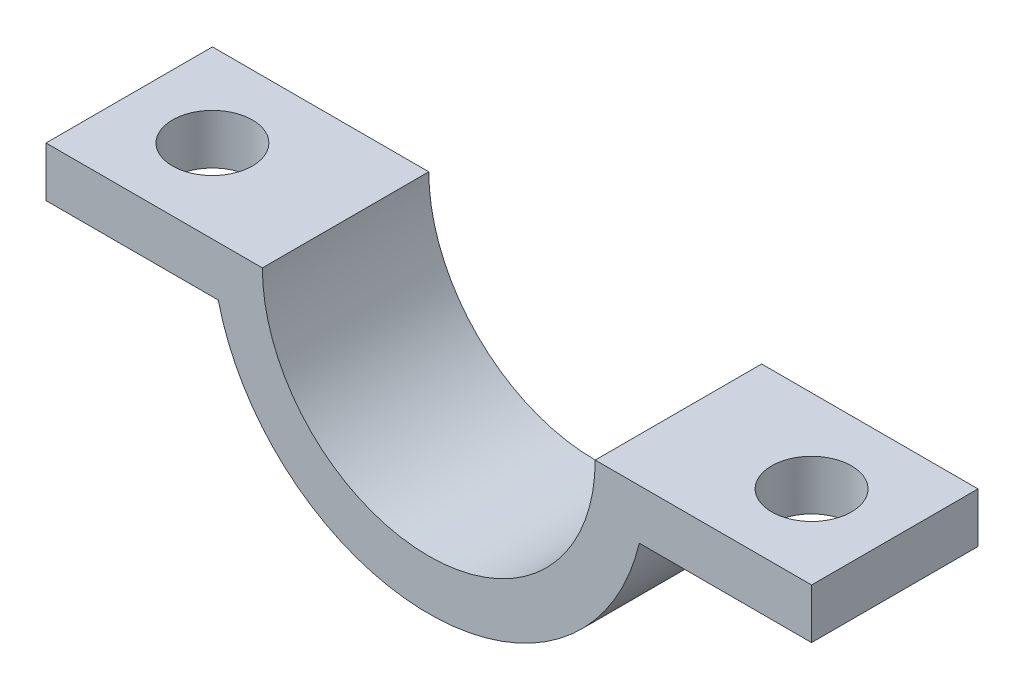
ISO-10303-21;
HEADER;
FILE_DESCRIPTION(('STEP AP214'),'2;1');
FILE_NAME('part.step','',(''),(''),'','','');
FILE_SCHEMA(('AUTOMOTIVE_DESIGN { 1 0 10303 214 1 1 1 1 }'));
ENDSEC;
DATA;
#1=APPLICATION_CONTEXT('core data for automotive mechanical design processes');
#2=APPLICATION_PROTOCOL_DEFINITION('international standard','automotive_design',2000,#1);
#3=PRODUCT_CONTEXT('',#1,'mechanical');
#4=PRODUCT('Part','Part','',(#3));
#5=PRODUCT_RELATED_PRODUCT_CATEGORY('part','',(#4));
#6=PRODUCT_DEFINITION_FORMATION('','',#4);
#7=PRODUCT_DEFINITION_CONTEXT('part definition',#1,'design');
#8=PRODUCT_DEFINITION('design','',#6,#7);
#9=PRODUCT_DEFINITION_SHAPE('','',#8);
#10=(LENGTH_UNIT() NAMED_UNIT(*) SI_UNIT(.MILLI.,.METRE.));
#11=(NAMED_UNIT(*) PLANE_ANGLE_UNIT() SI_UNIT($,.RADIAN.));
#12=(NAMED_UNIT(*) SI_UNIT($,.STERADIAN.) SOLID_ANGLE_UNIT());
#13=UNCERTAINTY_MEASURE_WITH_UNIT(LENGTH_MEASURE(1.E-05),#10,'distance_accuracy_value','');
#14=(GEOMETRIC_REPRESENTATION_CONTEXT(3) GLOBAL_UNCERTAINTY_ASSIGNED_CONTEXT((#13)) GLOBAL_UNIT_ASSIGNED_CONTEXT((#10,
#11,#12)) REPRESENTATION_CONTEXT('',''));
#15=CARTESIAN_POINT('',(0.,0.,0.));
#16=DIRECTION('',(0.,0.,1.));
#17=DIRECTION('',(1.,0.,0.));
#18=AXIS2_PLACEMENT_3D('',#15,#16,#17);
#19=CARTESIAN_POINT('',(11.5,0.,2.5));
#20=DIRECTION('',(-1.,0.,0.));
#21=DIRECTION('',(0.,0.,1.));
#22=AXIS2_PLACEMENT_3D('',#19,#20,#21);
#23=PLANE('',#22);
#24=DIRECTION('',(0.,1.,0.));
#25=VECTOR('',#24,1.);
#26=CARTESIAN_POINT('',(11.5,0.,-2.5));
#27=LINE('',#26,#25);
#28=CARTESIAN_POINT('',(11.5,-1.5,-2.5));
#29=VERTEX_POINT('',#28);
#30=CARTESIAN_POINT('',(11.5,0.,-2.5));
#31=VERTEX_POINT('',#30);
#32=EDGE_CURVE('E134',#29,#31,#27,.T.);
#33=ORIENTED_EDGE('',*,*,#32,.T.);
#34=DIRECTION('',(0.,0.,-1.));
#35=VECTOR('',#34,1.);
#36=CARTESIAN_POINT('',(11.5,0.,2.5));
#37=LINE('',#36,#35);
#38=CARTESIAN_POINT('',(11.5,0.,2.5));
#39=VERTEX_POINT('',#38);
#40=EDGE_CURVE('E11',#39,#31,#37,.T.);
#41=ORIENTED_EDGE('',*,*,#40,.F.);
#42=DIRECTION('',(0.,1.,0.));
#43=VECTOR('',#42,1.);
#44=CARTESIAN_POINT('',(11.5,0.,2.5));
#45=LINE('',#44,#43);
#46=CARTESIAN_POINT('',(11.5,-1.5,2.5));
#47=VERTEX_POINT('',#46);
#48=EDGE_CURVE('E148',#47,#39,#45,.T.);
#49=ORIENTED_EDGE('',*,*,#48,.F.);
#50=DIRECTION('',(0.,0.,-1.));
#51=VECTOR('',#50,1.);
#52=CARTESIAN_POINT('',(11.5,-1.5,2.5));
#53=LINE('',#52,#51);
#54=EDGE_CURVE('E130',#47,#29,#53,.T.);
#55=ORIENTED_EDGE('',*,*,#54,.T.);
#56=EDGE_LOOP('',(#33,#41,#49,#55));
#57=FACE_BOUND('',#56,.T.);
#58=ADVANCED_FACE('F36',(#57),#23,.F.);
#59=CARTESIAN_POINT('',(5.,0.,2.5));
#60=DIRECTION('',(0.,-1.,0.));
#61=DIRECTION('',(0.,0.,-1.));
#62=AXIS2_PLACEMENT_3D('',#59,#60,#61);
#63=PLANE('',#62);
#64=CARTESIAN_POINT('',(9.,0.,0.));
#65=DIRECTION('',(0.,1.,0.));
#66=DIRECTION('',(0.,0.,-1.));
#67=AXIS2_PLACEMENT_3D('',#64,#65,#66);
#68=CIRCLE('',#67,1.2);
#69=CARTESIAN_POINT('',(9.,0.,-1.2));
#70=VERTEX_POINT('',#69);
#71=EDGE_CURVE('E166',#70,#70,#68,.T.);
#72=ORIENTED_EDGE('',*,*,#71,.F.);
#73=EDGE_LOOP('',(#72));
#74=FACE_BOUND('',#73,.T.);
#75=DIRECTION('',(-1.,0.,0.));
#76=VECTOR('',#75,1.);
#77=CARTESIAN_POINT('',(5.,0.,-2.5));
#78=LINE('',#77,#76);
#79=CARTESIAN_POINT('',(5.,0.,-2.5));
#80=VERTEX_POINT('',#79);
#81=EDGE_CURVE('E137',#31,#80,#78,.T.);
#82=ORIENTED_EDGE('',*,*,#81,.T.);
#83=DIRECTION('',(0.,0.,-1.));
#84=VECTOR('',#83,1.);
#85=CARTESIAN_POINT('',(5.,0.,2.5));
#86=LINE('',#85,#84);
#87=CARTESIAN_POINT('',(5.,0.,2.5));
#88=VERTEX_POINT('',#87);
#89=EDGE_CURVE('E45',#88,#80,#86,.T.);
#90=ORIENTED_EDGE('',*,*,#89,.F.);
#91=DIRECTION('',(-1.,0.,0.));
#92=VECTOR('',#91,1.);
#93=CARTESIAN_POINT('',(5.,0.,2.5));
#94=LINE('',#93,#92);
#95=EDGE_CURVE('E97',#39,#88,#94,.T.);
#96=ORIENTED_EDGE('',*,*,#95,.F.);
#97=ORIENTED_EDGE('',*,*,#40,.T.);
#98=EDGE_LOOP('',(#82,#90,#96,#97));
#99=FACE_BOUND('',#98,.T.);
#100=ADVANCED_FACE('F206',(#74,#99),#63,.F.);
#101=CARTESIAN_POINT('',(0.,0.,2.5));
#102=DIRECTION('',(0.,0.,-1.));
#103=DIRECTION('',(-1.,0.,0.));
#104=AXIS2_PLACEMENT_3D('',#101,#102,#103);
#105=CYLINDRICAL_SURFACE('',#104,5.);
#106=CARTESIAN_POINT('',(0.,0.,-2.5));
#107=DIRECTION('',(0.,0.,-1.));
#108=DIRECTION('',(1.,0.,0.));
#109=AXIS2_PLACEMENT_3D('',#106,#107,#108);
#110=CIRCLE('',#109,5.);
#111=CARTESIAN_POINT('',(-5.,0.,-2.5));
#112=VERTEX_POINT('',#111);
#113=EDGE_CURVE('E139',#80,#112,#110,.T.);
#114=ORIENTED_EDGE('',*,*,#113,.T.);
#115=DIRECTION('',(0.,0.,-1.));
#116=VECTOR('',#115,1.);
#117=CARTESIAN_POINT('',(-5.,0.,2.5));
#118=LINE('',#117,#116);
#119=CARTESIAN_POINT('',(-5.,0.,2.5));
#120=VERTEX_POINT('',#119);
#121=EDGE_CURVE('E155',#120,#112,#118,.T.);
#122=ORIENTED_EDGE('',*,*,#121,.F.);
#123=CARTESIAN_POINT('',(0.,0.,2.5));
#124=DIRECTION('',(0.,0.,-1.));
#125=DIRECTION('',(1.,0.,0.));
#126=AXIS2_PLACEMENT_3D('',#123,#124,#125);
#127=CIRCLE('',#126,5.);
#128=EDGE_CURVE('E175',#88,#120,#127,.T.);
#129=ORIENTED_EDGE('',*,*,#128,.F.);
#130=ORIENTED_EDGE('',*,*,#89,.T.);
#131=EDGE_LOOP('',(#114,#122,#129,#130));
#132=FACE_BOUND('',#131,.T.);
#133=ADVANCED_FACE('F210',(#132),#105,.F.);
#134=CARTESIAN_POINT('',(-5.,0.,2.5));
#135=DIRECTION('',(0.,-1.,0.));
#136=DIRECTION('',(0.,0.,-1.));
#137=AXIS2_PLACEMENT_3D('',#134,#135,#136);
#138=PLANE('',#137);
#139=CARTESIAN_POINT('',(-9.,0.,0.));
#140=DIRECTION('',(0.,1.,0.));
#141=DIRECTION('',(0.,0.,1.));
#142=AXIS2_PLACEMENT_3D('',#139,#140,#141);
#143=CIRCLE('',#142,1.2);
#144=CARTESIAN_POINT('',(-9.,0.,1.2));
#145=VERTEX_POINT('',#144);
#146=EDGE_CURVE('E161',#145,#145,#143,.T.);
#147=ORIENTED_EDGE('',*,*,#146,.F.);
#148=EDGE_LOOP('',(#147));
#149=FACE_BOUND('',#148,.T.);
#150=DIRECTION('',(-1.,0.,0.));
#151=VECTOR('',#150,1.);
#152=CARTESIAN_POINT('',(-5.,0.,-2.5));
#153=LINE('',#152,#151);
#154=CARTESIAN_POINT('',(-11.5,0.,-2.5));
#155=VERTEX_POINT('',#154);
#156=EDGE_CURVE('E141',#112,#155,#153,.T.);
#157=ORIENTED_EDGE('',*,*,#156,.T.);
#158=DIRECTION('',(0.,0.,-1.));
#159=VECTOR('',#158,1.);
#160=CARTESIAN_POINT('',(-11.5,0.,2.5));
#161=LINE('',#160,#159);
#162=CARTESIAN_POINT('',(-11.5,0.,2.5));
#163=VERTEX_POINT('',#162);
#164=EDGE_CURVE('E152',#163,#155,#161,.T.);
#165=ORIENTED_EDGE('',*,*,#164,.F.);
#166=DIRECTION('',(-1.,0.,0.));
#167=VECTOR('',#166,1.);
#168=CARTESIAN_POINT('',(-5.,0.,2.5));
#169=LINE('',#168,#167);
#170=EDGE_CURVE('E177',#120,#163,#169,.T.);
#171=ORIENTED_EDGE('',*,*,#170,.F.);
#172=ORIENTED_EDGE('',*,*,#121,.T.);
#173=EDGE_LOOP('',(#157,#165,#171,#172));
#174=FACE_BOUND('',#173,.T.);
#175=ADVANCED_FACE('F183',(#149,#174),#138,.F.);
#176=CARTESIAN_POINT('',(-11.5,0.,2.5));
#177=DIRECTION('',(1.,0.,0.));
#178=DIRECTION('',(0.,0.,-1.));
#179=AXIS2_PLACEMENT_3D('',#176,#177,#178);
#180=PLANE('',#179);
#181=DIRECTION('',(0.,-1.,0.));
#182=VECTOR('',#181,1.);
#183=CARTESIAN_POINT('',(-11.5,0.,-2.5));
#184=LINE('',#183,#182);
#185=CARTESIAN_POINT('',(-11.5,-1.5,-2.5));
#186=VERTEX_POINT('',#185);
#187=EDGE_CURVE('E143',#155,#186,#184,.T.);
#188=ORIENTED_EDGE('',*,*,#187,.T.);
#189=DIRECTION('',(0.,0.,-1.));
#190=VECTOR('',#189,1.);
#191=CARTESIAN_POINT('',(-11.5,-1.5,2.5));
#192=LINE('',#191,#190);
#193=CARTESIAN_POINT('',(-11.5,-1.5,2.5));
#194=VERTEX_POINT('',#193);
#195=EDGE_CURVE('E125',#194,#186,#192,.T.);
#196=ORIENTED_EDGE('',*,*,#195,.F.);
#197=DIRECTION('',(0.,-1.,0.));
#198=VECTOR('',#197,1.);
#199=CARTESIAN_POINT('',(-11.5,0.,2.5));
#200=LINE('',#199,#198);
#201=EDGE_CURVE('E116',#163,#194,#200,.T.);
#202=ORIENTED_EDGE('',*,*,#201,.F.);
#203=ORIENTED_EDGE('',*,*,#164,.T.);
#204=EDGE_LOOP('',(#188,#196,#202,#203));
#205=FACE_BOUND('',#204,.T.);
#206=ADVANCED_FACE('F187',(#205),#180,.F.);
#207=CARTESIAN_POINT('',(-11.5,-1.5,2.5));
#208=DIRECTION('',(0.,1.,0.));
#209=DIRECTION('',(-1.,0.,0.));
#210=AXIS2_PLACEMENT_3D('',#207,#208,#209);
#211=PLANE('',#210);
#212=CARTESIAN_POINT('',(-9.,-1.5,0.));
#213=DIRECTION('',(0.,1.,0.));
#214=DIRECTION('',(-1.,0.,0.));
#215=AXIS2_PLACEMENT_3D('',#212,#213,#214);
#216=CIRCLE('',#215,1.2);
#217=CARTESIAN_POINT('',(-10.2,-1.5,0.));
#218=VERTEX_POINT('',#217);
#219=EDGE_CURVE('E39',#218,#218,#216,.T.);
#220=ORIENTED_EDGE('',*,*,#219,.T.);
#221=EDGE_LOOP('',(#220));
#222=FACE_BOUND('',#221,.T.);
#223=DIRECTION('',(1.,0.,0.));
#224=VECTOR('',#223,1.);
#225=CARTESIAN_POINT('',(-11.5,-1.5,-2.5));
#226=LINE('',#225,#224);
#227=CARTESIAN_POINT('',(-6.32455532033676,-1.5,-2.5));
#228=VERTEX_POINT('',#227);
#229=EDGE_CURVE('E124',#186,#228,#226,.T.);
#230=ORIENTED_EDGE('',*,*,#229,.T.);
#231=DIRECTION('',(0.,0.,-1.));
#232=VECTOR('',#231,1.);
#233=CARTESIAN_POINT('',(-6.32455532033676,-1.5,2.5));
#234=LINE('',#233,#232);
#235=CARTESIAN_POINT('',(-6.32455532033676,-1.5,2.5));
#236=VERTEX_POINT('',#235);
#237=EDGE_CURVE('E121',#236,#228,#234,.T.);
#238=ORIENTED_EDGE('',*,*,#237,.F.);
#239=DIRECTION('',(1.,0.,0.));
#240=VECTOR('',#239,1.);
#241=CARTESIAN_POINT('',(-11.5,-1.5,2.5));
#242=LINE('',#241,#240);
#243=EDGE_CURVE('E110',#194,#236,#242,.T.);
#244=ORIENTED_EDGE('',*,*,#243,.F.);
#245=ORIENTED_EDGE('',*,*,#195,.T.);
#246=EDGE_LOOP('',(#230,#238,#244,#245));
#247=FACE_BOUND('',#246,.T.);
#248=ADVANCED_FACE('F122',(#222,#247),#211,.F.);
#249=CARTESIAN_POINT('',(0.,0.,2.5));
#250=DIRECTION('',(0.,0.,-1.));
#251=DIRECTION('',(-1.,0.,0.));
#252=AXIS2_PLACEMENT_3D('',#249,#250,#251);
#253=CYLINDRICAL_SURFACE('',#252,6.5);
#254=CARTESIAN_POINT('',(0.,0.,-2.5));
#255=DIRECTION('',(0.,0.,1.));
#256=DIRECTION('',(1.,0.,0.));
#257=AXIS2_PLACEMENT_3D('',#254,#255,#256);
#258=CIRCLE('',#257,6.5);
#259=CARTESIAN_POINT('',(6.32455532033676,-1.5,-2.5));
#260=VERTEX_POINT('',#259);
#261=EDGE_CURVE('E83',#228,#260,#258,.T.);
#262=ORIENTED_EDGE('',*,*,#261,.T.);
#263=DIRECTION('',(0.,0.,-1.));
#264=VECTOR('',#263,1.);
#265=CARTESIAN_POINT('',(6.32455532033676,-1.5,2.5));
#266=LINE('',#265,#264);
#267=CARTESIAN_POINT('',(6.32455532033676,-1.5,2.5));
#268=VERTEX_POINT('',#267);
#269=EDGE_CURVE('E126',#268,#260,#266,.T.);
#270=ORIENTED_EDGE('',*,*,#269,.F.);
#271=CARTESIAN_POINT('',(0.,0.,2.5));
#272=DIRECTION('',(0.,0.,1.));
#273=DIRECTION('',(1.,0.,0.));
#274=AXIS2_PLACEMENT_3D('',#271,#272,#273);
#275=CIRCLE('',#274,6.5);
#276=EDGE_CURVE('E114',#236,#268,#275,.T.);
#277=ORIENTED_EDGE('',*,*,#276,.F.);
#278=ORIENTED_EDGE('',*,*,#237,.T.);
#279=EDGE_LOOP('',(#262,#270,#277,#278));
#280=FACE_BOUND('',#279,.T.);
#281=ADVANCED_FACE('F128',(#280),#253,.T.);
#282=CARTESIAN_POINT('',(11.5,-1.5,2.5));
#283=DIRECTION('',(0.,1.,0.));
#284=DIRECTION('',(-1.,0.,0.));
#285=AXIS2_PLACEMENT_3D('',#282,#283,#284);
#286=PLANE('',#285);
#287=CARTESIAN_POINT('',(9.,-1.5,0.));
#288=DIRECTION('',(0.,1.,0.));
#289=DIRECTION('',(-1.,0.,0.));
#290=AXIS2_PLACEMENT_3D('',#287,#288,#289);
#291=CIRCLE('',#290,1.2);
#292=CARTESIAN_POINT('',(7.8,-1.5,0.));
#293=VERTEX_POINT('',#292);
#294=EDGE_CURVE('E159',#293,#293,#291,.T.);
#295=ORIENTED_EDGE('',*,*,#294,.T.);
#296=EDGE_LOOP('',(#295));
#297=FACE_BOUND('',#296,.T.);
#298=DIRECTION('',(1.,0.,0.));
#299=VECTOR('',#298,1.);
#300=CARTESIAN_POINT('',(11.5,-1.5,-2.5));
#301=LINE('',#300,#299);
#302=EDGE_CURVE('E89',#260,#29,#301,.T.);
#303=ORIENTED_EDGE('',*,*,#302,.T.);
#304=ORIENTED_EDGE('',*,*,#54,.F.);
#305=DIRECTION('',(1.,0.,0.));
#306=VECTOR('',#305,1.);
#307=CARTESIAN_POINT('',(11.5,-1.5,2.5));
#308=LINE('',#307,#306);
#309=EDGE_CURVE('E54',#268,#47,#308,.T.);
#310=ORIENTED_EDGE('',*,*,#309,.F.);
#311=ORIENTED_EDGE('',*,*,#269,.T.);
#312=EDGE_LOOP('',(#303,#304,#310,#311));
#313=FACE_BOUND('',#312,.T.);
#314=ADVANCED_FACE('F195',(#297,#313),#286,.F.);
#315=CARTESIAN_POINT('',(0.,0.,2.5));
#316=DIRECTION('',(0.,0.,1.));
#317=DIRECTION('',(1.,0.,0.));
#318=AXIS2_PLACEMENT_3D('',#315,#316,#317);
#319=PLANE('',#318);
#320=ORIENTED_EDGE('',*,*,#48,.T.);
#321=ORIENTED_EDGE('',*,*,#95,.T.);
#322=ORIENTED_EDGE('',*,*,#128,.T.);
#323=ORIENTED_EDGE('',*,*,#170,.T.);
#324=ORIENTED_EDGE('',*,*,#201,.T.);
#325=ORIENTED_EDGE('',*,*,#243,.T.);
#326=ORIENTED_EDGE('',*,*,#276,.T.);
#327=ORIENTED_EDGE('',*,*,#309,.T.);
#328=EDGE_LOOP('',(#320,#321,#322,#323,#324,#325,#326,#327));
#329=FACE_BOUND('',#328,.T.);
#330=ADVANCED_FACE('F112',(#329),#319,.T.);
#331=CARTESIAN_POINT('',(0.,0.,-2.5));
#332=DIRECTION('',(0.,0.,1.));
#333=DIRECTION('',(1.,0.,0.));
#334=AXIS2_PLACEMENT_3D('',#331,#332,#333);
#335=PLANE('',#334);
#336=ORIENTED_EDGE('',*,*,#32,.F.);
#337=ORIENTED_EDGE('',*,*,#302,.F.);
#338=ORIENTED_EDGE('',*,*,#261,.F.);
#339=ORIENTED_EDGE('',*,*,#229,.F.);
#340=ORIENTED_EDGE('',*,*,#187,.F.);
#341=ORIENTED_EDGE('',*,*,#156,.F.);
#342=ORIENTED_EDGE('',*,*,#113,.F.);
#343=ORIENTED_EDGE('',*,*,#81,.F.);
#344=EDGE_LOOP('',(#336,#337,#338,#339,#340,#341,#342,#343));
#345=FACE_BOUND('',#344,.T.);
#346=ADVANCED_FACE('F190',(#345),#335,.F.);
#347=CARTESIAN_POINT('',(9.,-6.5,0.));
#348=DIRECTION('',(0.,1.,0.));
#349=DIRECTION('',(0.,0.,1.));
#350=AXIS2_PLACEMENT_3D('',#347,#348,#349);
#351=CYLINDRICAL_SURFACE('',#350,1.2);
#352=ORIENTED_EDGE('',*,*,#71,.T.);
#353=EDGE_LOOP('',(#352));
#354=FACE_BOUND('',#353,.T.);
#355=ORIENTED_EDGE('',*,*,#294,.F.);
#356=EDGE_LOOP('',(#355));
#357=FACE_BOUND('',#356,.T.);
#358=ADVANCED_FACE('F232',(#354,#357),#351,.F.);
#359=CARTESIAN_POINT('',(-9.,-6.5,0.));
#360=DIRECTION('',(0.,1.,0.));
#361=DIRECTION('',(0.,0.,1.));
#362=AXIS2_PLACEMENT_3D('',#359,#360,#361);
#363=CYLINDRICAL_SURFACE('',#362,1.2);
#364=ORIENTED_EDGE('',*,*,#146,.T.);
#365=EDGE_LOOP('',(#364));
#366=FACE_BOUND('',#365,.T.);
#367=ORIENTED_EDGE('',*,*,#219,.F.);
#368=EDGE_LOOP('',(#367));
#369=FACE_BOUND('',#368,.T.);
#370=ADVANCED_FACE('F230',(#366,#369),#363,.F.);
#371=CLOSED_SHELL('',(#58,#100,#133,#175,#206,#248,#281,#314,#330,#346,#358,#370));
#372=MANIFOLD_SOLID_BREP('B2',#371);
#373=ADVANCED_BREP_SHAPE_REPRESENTATION('',(#18,#372),#14);
#374=SHAPE_DEFINITION_REPRESENTATION(#9,#373);
ENDSEC;
END-ISO-10303-21;
